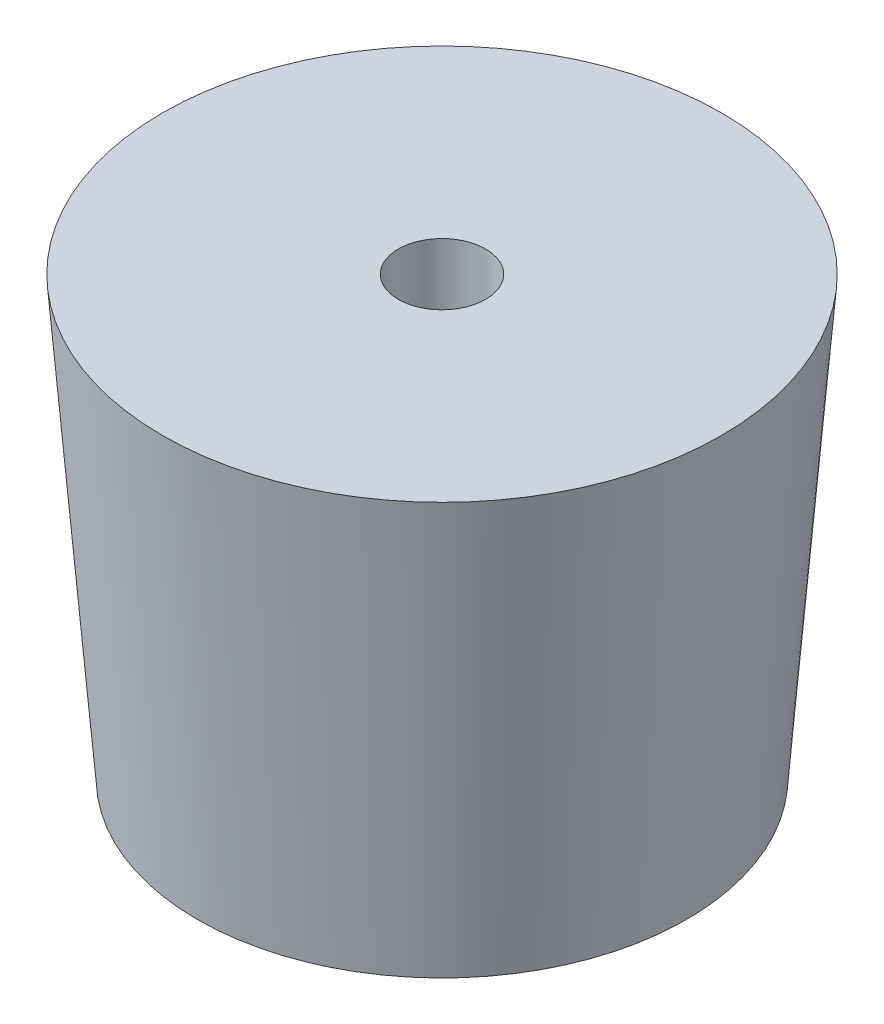
ISO-10303-21;
HEADER;
FILE_DESCRIPTION(('STEP AP214'),'2;1');
FILE_NAME('part.step','',(''),(''),'','','');
FILE_SCHEMA(('AUTOMOTIVE_DESIGN { 1 0 10303 214 1 1 1 1 }'));
ENDSEC;
DATA;
#1=APPLICATION_CONTEXT('core data for automotive mechanical design processes');
#2=APPLICATION_PROTOCOL_DEFINITION('international standard','automotive_design',2000,#1);
#3=PRODUCT_CONTEXT('',#1,'mechanical');
#4=PRODUCT('Part','Part','',(#3));
#5=PRODUCT_RELATED_PRODUCT_CATEGORY('part','',(#4));
#6=PRODUCT_DEFINITION_FORMATION('','',#4);
#7=PRODUCT_DEFINITION_CONTEXT('part definition',#1,'design');
#8=PRODUCT_DEFINITION('design','',#6,#7);
#9=PRODUCT_DEFINITION_SHAPE('','',#8);
#10=(LENGTH_UNIT() NAMED_UNIT(*) SI_UNIT(.MILLI.,.METRE.));
#11=(NAMED_UNIT(*) PLANE_ANGLE_UNIT() SI_UNIT($,.RADIAN.));
#12=(NAMED_UNIT(*) SI_UNIT($,.STERADIAN.) SOLID_ANGLE_UNIT());
#13=UNCERTAINTY_MEASURE_WITH_UNIT(LENGTH_MEASURE(1.E-05),#10,'distance_accuracy_value','');
#14=(GEOMETRIC_REPRESENTATION_CONTEXT(3) GLOBAL_UNCERTAINTY_ASSIGNED_CONTEXT((#13)) GLOBAL_UNIT_ASSIGNED_CONTEXT((#10,
#11,#12)) REPRESENTATION_CONTEXT('',''));
#15=CARTESIAN_POINT('',(0.,0.,0.));
#16=DIRECTION('',(0.,0.,1.));
#17=DIRECTION('',(1.,0.,0.));
#18=AXIS2_PLACEMENT_3D('',#15,#16,#17);
#19=CARTESIAN_POINT('',(16.,0.,0.));
#20=DIRECTION('',(0.,-1.,0.));
#21=DIRECTION('',(0.,0.,-1.));
#22=AXIS2_PLACEMENT_3D('',#19,#20,#21);
#23=PLANE('',#22);
#24=CARTESIAN_POINT('',(0.,0.,0.));
#25=DIRECTION('',(0.,1.,0.));
#26=DIRECTION('',(0.,0.,1.));
#27=AXIS2_PLACEMENT_3D('',#24,#25,#26);
#28=CIRCLE('',#27,2.5);
#29=CARTESIAN_POINT('',(0.,0.,2.5));
#30=VERTEX_POINT('',#29);
#31=EDGE_CURVE('E10',#30,#30,#28,.T.);
#32=ORIENTED_EDGE('',*,*,#31,.F.);
#33=EDGE_LOOP('',(#32));
#34=FACE_BOUND('',#33,.T.);
#35=CARTESIAN_POINT('',(0.,0.,0.));
#36=DIRECTION('',(0.,1.,0.));
#37=DIRECTION('',(0.,0.,1.));
#38=AXIS2_PLACEMENT_3D('',#35,#36,#37);
#39=CIRCLE('',#38,16.);
#40=CARTESIAN_POINT('',(0.,0.,16.));
#41=VERTEX_POINT('',#40);
#42=EDGE_CURVE('E52',#41,#41,#39,.T.);
#43=ORIENTED_EDGE('',*,*,#42,.T.);
#44=EDGE_LOOP('',(#43));
#45=FACE_BOUND('',#44,.T.);
#46=ADVANCED_FACE('F30',(#34,#45),#23,.F.);
#47=CARTESIAN_POINT('',(0.,0.,0.));
#48=DIRECTION('',(0.,1.,0.));
#49=DIRECTION('',(0.,0.,1.));
#50=AXIS2_PLACEMENT_3D('',#47,#48,#49);
#51=CYLINDRICAL_SURFACE('',#50,2.5);
#52=CARTESIAN_POINT('',(0.,-16.,0.));
#53=DIRECTION('',(0.,1.,0.));
#54=DIRECTION('',(0.,0.,1.));
#55=AXIS2_PLACEMENT_3D('',#52,#53,#54);
#56=CIRCLE('',#55,2.5);
#57=CARTESIAN_POINT('',(0.,-16.,2.5));
#58=VERTEX_POINT('',#57);
#59=EDGE_CURVE('E36',#58,#58,#56,.T.);
#60=ORIENTED_EDGE('',*,*,#59,.F.);
#61=EDGE_LOOP('',(#60));
#62=FACE_BOUND('',#61,.T.);
#63=ORIENTED_EDGE('',*,*,#31,.T.);
#64=EDGE_LOOP('',(#63));
#65=FACE_BOUND('',#64,.T.);
#66=ADVANCED_FACE('F77',(#62,#65),#51,.F.);
#67=CARTESIAN_POINT('',(2.5,-16.,0.));
#68=DIRECTION('',(0.,1.,0.));
#69=DIRECTION('',(0.,0.,1.));
#70=AXIS2_PLACEMENT_3D('',#67,#68,#69);
#71=PLANE('',#70);
#72=CARTESIAN_POINT('',(0.,-16.,0.));
#73=DIRECTION('',(0.,1.,0.));
#74=DIRECTION('',(0.,0.,1.));
#75=AXIS2_PLACEMENT_3D('',#72,#73,#74);
#76=CIRCLE('',#75,7.);
#77=CARTESIAN_POINT('',(0.,-16.,7.));
#78=VERTEX_POINT('',#77);
#79=EDGE_CURVE('E40',#78,#78,#76,.T.);
#80=ORIENTED_EDGE('',*,*,#79,.F.);
#81=EDGE_LOOP('',(#80));
#82=FACE_BOUND('',#81,.T.);
#83=ORIENTED_EDGE('',*,*,#59,.T.);
#84=EDGE_LOOP('',(#83));
#85=FACE_BOUND('',#84,.T.);
#86=ADVANCED_FACE('F72',(#82,#85),#71,.F.);
#87=CARTESIAN_POINT('',(0.,0.,0.));
#88=DIRECTION('',(0.,1.,0.));
#89=DIRECTION('',(0.,0.,1.));
#90=AXIS2_PLACEMENT_3D('',#87,#88,#89);
#91=CYLINDRICAL_SURFACE('',#90,7.);
#92=CARTESIAN_POINT('',(0.,-25.,0.));
#93=DIRECTION('',(0.,1.,0.));
#94=DIRECTION('',(0.,0.,1.));
#95=AXIS2_PLACEMENT_3D('',#92,#93,#94);
#96=CIRCLE('',#95,7.);
#97=CARTESIAN_POINT('',(0.,-25.,7.));
#98=VERTEX_POINT('',#97);
#99=EDGE_CURVE('E44',#98,#98,#96,.T.);
#100=ORIENTED_EDGE('',*,*,#99,.F.);
#101=EDGE_LOOP('',(#100));
#102=FACE_BOUND('',#101,.T.);
#103=ORIENTED_EDGE('',*,*,#79,.T.);
#104=EDGE_LOOP('',(#103));
#105=FACE_BOUND('',#104,.T.);
#106=ADVANCED_FACE('F66',(#102,#105),#91,.F.);
#107=CARTESIAN_POINT('',(7.,-25.,0.));
#108=DIRECTION('',(0.,1.,0.));
#109=DIRECTION('',(0.,0.,1.));
#110=AXIS2_PLACEMENT_3D('',#107,#108,#109);
#111=PLANE('',#110);
#112=CARTESIAN_POINT('',(0.,-25.,0.));
#113=DIRECTION('',(0.,1.,0.));
#114=DIRECTION('',(0.,0.,1.));
#115=AXIS2_PLACEMENT_3D('',#112,#113,#114);
#116=CIRCLE('',#115,14.);
#117=CARTESIAN_POINT('',(0.,-25.,14.));
#118=VERTEX_POINT('',#117);
#119=EDGE_CURVE('E49',#118,#118,#116,.T.);
#120=ORIENTED_EDGE('',*,*,#119,.F.);
#121=EDGE_LOOP('',(#120));
#122=FACE_BOUND('',#121,.T.);
#123=ORIENTED_EDGE('',*,*,#99,.T.);
#124=EDGE_LOOP('',(#123));
#125=FACE_BOUND('',#124,.T.);
#126=ADVANCED_FACE('F60',(#122,#125),#111,.F.);
#127=CARTESIAN_POINT('',(0.,-25.,0.));
#128=DIRECTION('',(0.,1.,0.));
#129=DIRECTION('',(0.,0.,1.));
#130=AXIS2_PLACEMENT_3D('',#127,#128,#129);
#131=CONICAL_SURFACE('',#130,14.,0.0798299857122373);
#132=ORIENTED_EDGE('',*,*,#42,.F.);
#133=EDGE_LOOP('',(#132));
#134=FACE_BOUND('',#133,.T.);
#135=ORIENTED_EDGE('',*,*,#119,.T.);
#136=EDGE_LOOP('',(#135));
#137=FACE_BOUND('',#136,.T.);
#138=ADVANCED_FACE('F57',(#134,#137),#131,.T.);
#139=CLOSED_SHELL('',(#46,#66,#86,#106,#126,#138));
#140=MANIFOLD_SOLID_BREP('B2',#139);
#141=ADVANCED_BREP_SHAPE_REPRESENTATION('',(#18,#140),#14);
#142=SHAPE_DEFINITION_REPRESENTATION(#9,#141);
ENDSEC;
END-ISO-10303-21;
